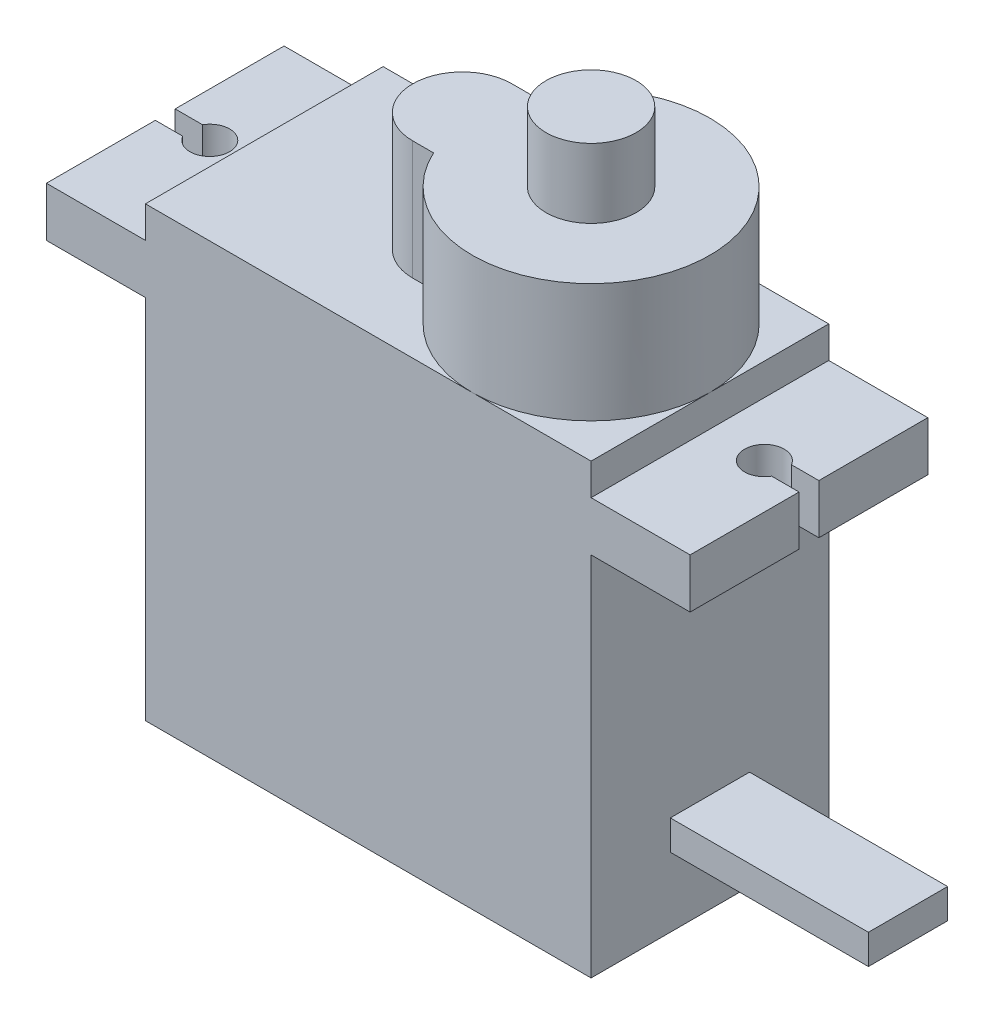
ISO-10303-21;
HEADER;
FILE_DESCRIPTION(('STEP AP214'),'2;1');
FILE_NAME('part.step','',(''),(''),'','','');
FILE_SCHEMA(('AUTOMOTIVE_DESIGN { 1 0 10303 214 1 1 1 1 }'));
ENDSEC;
DATA;
#1=APPLICATION_CONTEXT('core data for automotive mechanical design processes');
#2=APPLICATION_PROTOCOL_DEFINITION('international standard','automotive_design',2000,#1);
#3=PRODUCT_CONTEXT('',#1,'mechanical');
#4=PRODUCT('Part','Part','',(#3));
#5=PRODUCT_RELATED_PRODUCT_CATEGORY('part','',(#4));
#6=PRODUCT_DEFINITION_FORMATION('','',#4);
#7=PRODUCT_DEFINITION_CONTEXT('part definition',#1,'design');
#8=PRODUCT_DEFINITION('design','',#6,#7);
#9=PRODUCT_DEFINITION_SHAPE('','',#8);
#10=(LENGTH_UNIT() NAMED_UNIT(*) SI_UNIT(.MILLI.,.METRE.));
#11=(NAMED_UNIT(*) PLANE_ANGLE_UNIT() SI_UNIT($,.RADIAN.));
#12=(NAMED_UNIT(*) SI_UNIT($,.STERADIAN.) SOLID_ANGLE_UNIT());
#13=UNCERTAINTY_MEASURE_WITH_UNIT(LENGTH_MEASURE(1.E-05),#10,'distance_accuracy_value','');
#14=(GEOMETRIC_REPRESENTATION_CONTEXT(3) GLOBAL_UNCERTAINTY_ASSIGNED_CONTEXT((#13)) GLOBAL_UNIT_ASSIGNED_CONTEXT((#10,
#11,#12)) REPRESENTATION_CONTEXT('',''));
#15=CARTESIAN_POINT('',(0.,0.,0.));
#16=DIRECTION('',(0.,0.,1.));
#17=DIRECTION('',(1.,0.,0.));
#18=AXIS2_PLACEMENT_3D('',#15,#16,#17);
#19=CARTESIAN_POINT('',(-11.25,11.3,-12.));
#20=DIRECTION('',(0.,1.,0.));
#21=DIRECTION('',(0.,0.,1.));
#22=AXIS2_PLACEMENT_3D('',#19,#20,#21);
#23=PLANE('',#22);
#24=CARTESIAN_POINT('',(5.25,11.3,-6.));
#25=DIRECTION('',(0.,1.,0.));
#26=DIRECTION('',(0.,0.,1.));
#27=AXIS2_PLACEMENT_3D('',#24,#25,#26);
#28=CIRCLE('',#27,6.);
#29=CARTESIAN_POINT('',(5.25,11.3,0.));
#30=VERTEX_POINT('',#29);
#31=CARTESIAN_POINT('',(11.25,11.3,-6.));
#32=VERTEX_POINT('',#31);
#33=EDGE_CURVE('E11',#30,#32,#28,.T.);
#34=ORIENTED_EDGE('',*,*,#33,.F.);
#35=DIRECTION('',(-1.,0.,0.));
#36=VECTOR('',#35,1.);
#37=CARTESIAN_POINT('',(-11.25,11.3,0.));
#38=LINE('',#37,#36);
#39=CARTESIAN_POINT('',(11.25,11.3,0.));
#40=VERTEX_POINT('',#39);
#41=EDGE_CURVE('E396',#40,#30,#38,.T.);
#42=ORIENTED_EDGE('',*,*,#41,.F.);
#43=DIRECTION('',(0.,0.,1.));
#44=VECTOR('',#43,1.);
#45=CARTESIAN_POINT('',(11.25,11.3,-12.));
#46=LINE('',#45,#44);
#47=EDGE_CURVE('E439',#32,#40,#46,.T.);
#48=ORIENTED_EDGE('',*,*,#47,.F.);
#49=EDGE_LOOP('',(#34,#42,#48));
#50=FACE_BOUND('',#49,.T.);
#51=ADVANCED_FACE('F37',(#50),#23,.T.);
#52=CARTESIAN_POINT('',(5.25,11.3,-12.));
#53=VERTEX_POINT('',#52);
#54=EDGE_CURVE('E46',#32,#53,#28,.T.);
#55=ORIENTED_EDGE('',*,*,#54,.F.);
#56=CARTESIAN_POINT('',(11.25,11.3,-12.));
#57=VERTEX_POINT('',#56);
#58=EDGE_CURVE('E436',#57,#32,#46,.T.);
#59=ORIENTED_EDGE('',*,*,#58,.F.);
#60=DIRECTION('',(-1.,0.,0.));
#61=VECTOR('',#60,1.);
#62=CARTESIAN_POINT('',(-11.25,11.3,-12.));
#63=LINE('',#62,#61);
#64=EDGE_CURVE('E360',#57,#53,#63,.T.);
#65=ORIENTED_EDGE('',*,*,#64,.T.);
#66=EDGE_LOOP('',(#55,#59,#65));
#67=FACE_BOUND('',#66,.T.);
#68=ADVANCED_FACE('F505',(#67),#23,.T.);
#69=CARTESIAN_POINT('',(16.25,9.69999999999999,-12.));
#70=DIRECTION('',(1.,0.,0.));
#71=DIRECTION('',(0.,0.,-1.));
#72=AXIS2_PLACEMENT_3D('',#69,#70,#71);
#73=PLANE('',#72);
#74=DIRECTION('',(0.,1.,0.));
#75=VECTOR('',#74,1.);
#76=CARTESIAN_POINT('',(16.25,7.19999999999999,-5.5));
#77=LINE('',#76,#75);
#78=CARTESIAN_POINT('',(16.25,7.19999999999999,-5.5));
#79=VERTEX_POINT('',#78);
#80=CARTESIAN_POINT('',(16.25,9.69999999999999,-5.5));
#81=VERTEX_POINT('',#80);
#82=EDGE_CURVE('E279',#79,#81,#77,.T.);
#83=ORIENTED_EDGE('',*,*,#82,.T.);
#84=DIRECTION('',(0.,0.,1.));
#85=VECTOR('',#84,1.);
#86=CARTESIAN_POINT('',(16.25,9.69999999999999,-12.));
#87=LINE('',#86,#85);
#88=CARTESIAN_POINT('',(16.25,9.69999999999999,0.));
#89=VERTEX_POINT('',#88);
#90=EDGE_CURVE('E444',#81,#89,#87,.T.);
#91=ORIENTED_EDGE('',*,*,#90,.T.);
#92=DIRECTION('',(0.,1.,0.));
#93=VECTOR('',#92,1.);
#94=CARTESIAN_POINT('',(16.25,9.69999999999999,0.));
#95=LINE('',#94,#93);
#96=CARTESIAN_POINT('',(16.25,7.19999999999999,0.));
#97=VERTEX_POINT('',#96);
#98=EDGE_CURVE('E386',#97,#89,#95,.T.);
#99=ORIENTED_EDGE('',*,*,#98,.F.);
#100=DIRECTION('',(0.,0.,1.));
#101=VECTOR('',#100,1.);
#102=CARTESIAN_POINT('',(16.25,7.19999999999999,-12.));
#103=LINE('',#102,#101);
#104=EDGE_CURVE('E447',#79,#97,#103,.T.);
#105=ORIENTED_EDGE('',*,*,#104,.F.);
#106=EDGE_LOOP('',(#83,#91,#99,#105));
#107=FACE_BOUND('',#106,.T.);
#108=ADVANCED_FACE('F488',(#107),#73,.T.);
#109=CARTESIAN_POINT('',(-16.25,9.69999999999999,-12.));
#110=DIRECTION('',(-1.,0.,0.));
#111=DIRECTION('',(0.,0.,1.));
#112=AXIS2_PLACEMENT_3D('',#109,#110,#111);
#113=PLANE('',#112);
#114=DIRECTION('',(0.,1.,0.));
#115=VECTOR('',#114,1.);
#116=CARTESIAN_POINT('',(-16.25,7.19999999999999,-6.5));
#117=LINE('',#116,#115);
#118=CARTESIAN_POINT('',(-16.25,7.19999999999999,-6.5));
#119=VERTEX_POINT('',#118);
#120=CARTESIAN_POINT('',(-16.25,9.69999999999999,-6.5));
#121=VERTEX_POINT('',#120);
#122=EDGE_CURVE('E305',#119,#121,#117,.T.);
#123=ORIENTED_EDGE('',*,*,#122,.T.);
#124=DIRECTION('',(0.,0.,1.));
#125=VECTOR('',#124,1.);
#126=CARTESIAN_POINT('',(-16.25,9.69999999999999,-12.));
#127=LINE('',#126,#125);
#128=CARTESIAN_POINT('',(-16.25,9.69999999999999,-12.));
#129=VERTEX_POINT('',#128);
#130=EDGE_CURVE('E427',#129,#121,#127,.T.);
#131=ORIENTED_EDGE('',*,*,#130,.F.);
#132=DIRECTION('',(0.,-1.,0.));
#133=VECTOR('',#132,1.);
#134=CARTESIAN_POINT('',(-16.25,9.69999999999999,-12.));
#135=LINE('',#134,#133);
#136=CARTESIAN_POINT('',(-16.25,7.19999999999999,-12.));
#137=VERTEX_POINT('',#136);
#138=EDGE_CURVE('E369',#129,#137,#135,.T.);
#139=ORIENTED_EDGE('',*,*,#138,.T.);
#140=DIRECTION('',(0.,0.,1.));
#141=VECTOR('',#140,1.);
#142=CARTESIAN_POINT('',(-16.25,7.19999999999999,-12.));
#143=LINE('',#142,#141);
#144=EDGE_CURVE('E423',#137,#119,#143,.T.);
#145=ORIENTED_EDGE('',*,*,#144,.T.);
#146=EDGE_LOOP('',(#123,#131,#139,#145));
#147=FACE_BOUND('',#146,.T.);
#148=ADVANCED_FACE('F535',(#147),#113,.T.);
#149=CARTESIAN_POINT('',(11.25,7.19999999999999,-12.));
#150=DIRECTION('',(1.,0.,0.));
#151=DIRECTION('',(0.,1.,0.));
#152=AXIS2_PLACEMENT_3D('',#149,#150,#151);
#153=PLANE('',#152);
#154=DIRECTION('',(0.,1.,0.));
#155=VECTOR('',#154,1.);
#156=CARTESIAN_POINT('',(11.25,7.19999999999999,0.));
#157=LINE('',#156,#155);
#158=CARTESIAN_POINT('',(11.25,-11.3,0.));
#159=VERTEX_POINT('',#158);
#160=CARTESIAN_POINT('',(11.25,7.19999999999999,0.));
#161=VERTEX_POINT('',#160);
#162=EDGE_CURVE('E342',#159,#161,#157,.T.);
#163=ORIENTED_EDGE('',*,*,#162,.F.);
#164=DIRECTION('',(0.,0.,1.));
#165=VECTOR('',#164,1.);
#166=CARTESIAN_POINT('',(11.25,-11.3,-12.));
#167=LINE('',#166,#165);
#168=CARTESIAN_POINT('',(11.25,-11.3,-12.));
#169=VERTEX_POINT('',#168);
#170=EDGE_CURVE('E416',#169,#159,#167,.T.);
#171=ORIENTED_EDGE('',*,*,#170,.F.);
#172=DIRECTION('',(0.,1.,0.));
#173=VECTOR('',#172,1.);
#174=CARTESIAN_POINT('',(11.25,7.19999999999999,-12.));
#175=LINE('',#174,#173);
#176=CARTESIAN_POINT('',(11.25,7.19999999999999,-12.));
#177=VERTEX_POINT('',#176);
#178=EDGE_CURVE('E343',#169,#177,#175,.T.);
#179=ORIENTED_EDGE('',*,*,#178,.T.);
#180=DIRECTION('',(0.,0.,1.));
#181=VECTOR('',#180,1.);
#182=CARTESIAN_POINT('',(11.25,7.19999999999999,-12.));
#183=LINE('',#182,#181);
#184=EDGE_CURVE('E41',#177,#161,#183,.T.);
#185=ORIENTED_EDGE('',*,*,#184,.T.);
#186=EDGE_LOOP('',(#163,#171,#179,#185));
#187=FACE_BOUND('',#186,.T.);
#188=DIRECTION('',(0.,0.,-1.));
#189=VECTOR('',#188,1.);
#190=CARTESIAN_POINT('',(11.25,-7.80000000000001,-4.));
#191=LINE('',#190,#189);
#192=CARTESIAN_POINT('',(11.25,-7.80000000000001,-4.));
#193=VERTEX_POINT('',#192);
#194=CARTESIAN_POINT('',(11.25,-7.80000000000001,-8.));
#195=VERTEX_POINT('',#194);
#196=EDGE_CURVE('E327',#193,#195,#191,.T.);
#197=ORIENTED_EDGE('',*,*,#196,.F.);
#198=DIRECTION('',(0.,-1.,0.));
#199=VECTOR('',#198,1.);
#200=CARTESIAN_POINT('',(11.25,-6.30000000000001,-4.));
#201=LINE('',#200,#199);
#202=CARTESIAN_POINT('',(11.25,-6.30000000000001,-4.));
#203=VERTEX_POINT('',#202);
#204=EDGE_CURVE('E308',#203,#193,#201,.T.);
#205=ORIENTED_EDGE('',*,*,#204,.F.);
#206=DIRECTION('',(0.,0.,1.));
#207=VECTOR('',#206,1.);
#208=CARTESIAN_POINT('',(11.25,-6.30000000000001,-4.));
#209=LINE('',#208,#207);
#210=CARTESIAN_POINT('',(11.25,-6.30000000000001,-8.));
#211=VERTEX_POINT('',#210);
#212=EDGE_CURVE('E318',#211,#203,#209,.T.);
#213=ORIENTED_EDGE('',*,*,#212,.F.);
#214=DIRECTION('',(0.,1.,0.));
#215=VECTOR('',#214,1.);
#216=CARTESIAN_POINT('',(11.25,-6.30000000000001,-8.));
#217=LINE('',#216,#215);
#218=EDGE_CURVE('E329',#195,#211,#217,.T.);
#219=ORIENTED_EDGE('',*,*,#218,.F.);
#220=EDGE_LOOP('',(#197,#205,#213,#219));
#221=FACE_BOUND('',#220,.T.);
#222=ADVANCED_FACE('F39',(#187,#221),#153,.T.);
#223=CARTESIAN_POINT('',(-11.25,-11.3,-12.));
#224=DIRECTION('',(0.,-1.,0.));
#225=DIRECTION('',(0.,0.,-1.));
#226=AXIS2_PLACEMENT_3D('',#223,#224,#225);
#227=PLANE('',#226);
#228=DIRECTION('',(1.,0.,0.));
#229=VECTOR('',#228,1.);
#230=CARTESIAN_POINT('',(-11.25,-11.3,0.));
#231=LINE('',#230,#229);
#232=CARTESIAN_POINT('',(-11.25,-11.3,0.));
#233=VERTEX_POINT('',#232);
#234=EDGE_CURVE('E347',#233,#159,#231,.T.);
#235=ORIENTED_EDGE('',*,*,#234,.F.);
#236=DIRECTION('',(0.,0.,1.));
#237=VECTOR('',#236,1.);
#238=CARTESIAN_POINT('',(-11.25,-11.3,-12.));
#239=LINE('',#238,#237);
#240=CARTESIAN_POINT('',(-11.25,-11.3,-12.));
#241=VERTEX_POINT('',#240);
#242=EDGE_CURVE('E419',#241,#233,#239,.T.);
#243=ORIENTED_EDGE('',*,*,#242,.F.);
#244=DIRECTION('',(1.,0.,0.));
#245=VECTOR('',#244,1.);
#246=CARTESIAN_POINT('',(-11.25,-11.3,-12.));
#247=LINE('',#246,#245);
#248=EDGE_CURVE('E378',#241,#169,#247,.T.);
#249=ORIENTED_EDGE('',*,*,#248,.T.);
#250=ORIENTED_EDGE('',*,*,#170,.T.);
#251=EDGE_LOOP('',(#235,#243,#249,#250));
#252=FACE_BOUND('',#251,.T.);
#253=ADVANCED_FACE('F463',(#252),#227,.T.);
#254=CARTESIAN_POINT('',(-11.25,7.19999999999999,-12.));
#255=DIRECTION('',(-1.,0.,0.));
#256=DIRECTION('',(0.,-1.,0.));
#257=AXIS2_PLACEMENT_3D('',#254,#255,#256);
#258=PLANE('',#257);
#259=DIRECTION('',(0.,-1.,0.));
#260=VECTOR('',#259,1.);
#261=CARTESIAN_POINT('',(-11.25,7.19999999999999,0.));
#262=LINE('',#261,#260);
#263=CARTESIAN_POINT('',(-11.25,7.19999999999999,0.));
#264=VERTEX_POINT('',#263);
#265=EDGE_CURVE('E411',#264,#233,#262,.T.);
#266=ORIENTED_EDGE('',*,*,#265,.F.);
#267=DIRECTION('',(0.,0.,1.));
#268=VECTOR('',#267,1.);
#269=CARTESIAN_POINT('',(-11.25,7.19999999999999,-12.));
#270=LINE('',#269,#268);
#271=CARTESIAN_POINT('',(-11.25,7.19999999999999,-12.));
#272=VERTEX_POINT('',#271);
#273=EDGE_CURVE('E421',#272,#264,#270,.T.);
#274=ORIENTED_EDGE('',*,*,#273,.F.);
#275=DIRECTION('',(0.,-1.,0.));
#276=VECTOR('',#275,1.);
#277=CARTESIAN_POINT('',(-11.25,7.19999999999999,-12.));
#278=LINE('',#277,#276);
#279=EDGE_CURVE('E375',#272,#241,#278,.T.);
#280=ORIENTED_EDGE('',*,*,#279,.T.);
#281=ORIENTED_EDGE('',*,*,#242,.T.);
#282=EDGE_LOOP('',(#266,#274,#280,#281));
#283=FACE_BOUND('',#282,.T.);
#284=ADVANCED_FACE('F532',(#283),#258,.T.);
#285=CARTESIAN_POINT('',(-16.25,7.19999999999999,-12.));
#286=DIRECTION('',(0.,-1.,0.));
#287=DIRECTION('',(0.,0.,-1.));
#288=AXIS2_PLACEMENT_3D('',#285,#286,#287);
#289=PLANE('',#288);
#290=DIRECTION('',(-1.,0.,0.));
#291=VECTOR('',#290,1.);
#292=CARTESIAN_POINT('',(-16.25,7.19999999999999,-6.5));
#293=LINE('',#292,#291);
#294=CARTESIAN_POINT('',(-14.8660254037844,7.19999999999999,-6.5));
#295=VERTEX_POINT('',#294);
#296=EDGE_CURVE('E295',#295,#119,#293,.T.);
#297=ORIENTED_EDGE('',*,*,#296,.T.);
#298=ORIENTED_EDGE('',*,*,#144,.F.);
#299=DIRECTION('',(1.,0.,0.));
#300=VECTOR('',#299,1.);
#301=CARTESIAN_POINT('',(-16.25,7.19999999999999,-12.));
#302=LINE('',#301,#300);
#303=EDGE_CURVE('E372',#137,#272,#302,.T.);
#304=ORIENTED_EDGE('',*,*,#303,.T.);
#305=ORIENTED_EDGE('',*,*,#273,.T.);
#306=DIRECTION('',(1.,0.,0.));
#307=VECTOR('',#306,1.);
#308=CARTESIAN_POINT('',(-16.25,7.19999999999999,0.));
#309=LINE('',#308,#307);
#310=CARTESIAN_POINT('',(-16.25,7.19999999999999,0.));
#311=VERTEX_POINT('',#310);
#312=EDGE_CURVE('E408',#311,#264,#309,.T.);
#313=ORIENTED_EDGE('',*,*,#312,.F.);
#314=CARTESIAN_POINT('',(-16.25,7.19999999999999,-5.5));
#315=VERTEX_POINT('',#314);
#316=EDGE_CURVE('E426',#315,#311,#143,.T.);
#317=ORIENTED_EDGE('',*,*,#316,.F.);
#318=DIRECTION('',(1.,0.,0.));
#319=VECTOR('',#318,1.);
#320=CARTESIAN_POINT('',(-16.25,7.19999999999999,-5.5));
#321=LINE('',#320,#319);
#322=CARTESIAN_POINT('',(-14.8660254037844,7.19999999999999,-5.5));
#323=VERTEX_POINT('',#322);
#324=EDGE_CURVE('E288',#315,#323,#321,.T.);
#325=ORIENTED_EDGE('',*,*,#324,.T.);
#326=CARTESIAN_POINT('',(-14.,7.19999999999999,-6.));
#327=DIRECTION('',(0.,1.,0.));
#328=DIRECTION('',(0.,0.,1.));
#329=AXIS2_PLACEMENT_3D('',#326,#327,#328);
#330=CIRCLE('',#329,1.);
#331=EDGE_CURVE('E291',#323,#295,#330,.T.);
#332=ORIENTED_EDGE('',*,*,#331,.T.);
#333=EDGE_LOOP('',(#297,#298,#304,#305,#313,#317,#325,#332));
#334=FACE_BOUND('',#333,.T.);
#335=ADVANCED_FACE('F529',(#334),#289,.T.);
#336=DIRECTION('',(0.,1.,0.));
#337=VECTOR('',#336,1.);
#338=CARTESIAN_POINT('',(-16.25,7.19999999999999,-5.5));
#339=LINE('',#338,#337);
#340=CARTESIAN_POINT('',(-16.25,9.69999999999999,-5.5));
#341=VERTEX_POINT('',#340);
#342=EDGE_CURVE('E298',#315,#341,#339,.T.);
#343=ORIENTED_EDGE('',*,*,#342,.F.);
#344=ORIENTED_EDGE('',*,*,#316,.T.);
#345=DIRECTION('',(0.,-1.,0.));
#346=VECTOR('',#345,1.);
#347=CARTESIAN_POINT('',(-16.25,9.69999999999999,0.));
#348=LINE('',#347,#346);
#349=CARTESIAN_POINT('',(-16.25,9.69999999999999,0.));
#350=VERTEX_POINT('',#349);
#351=EDGE_CURVE('E405',#350,#311,#348,.T.);
#352=ORIENTED_EDGE('',*,*,#351,.F.);
#353=EDGE_CURVE('E430',#341,#350,#127,.T.);
#354=ORIENTED_EDGE('',*,*,#353,.F.);
#355=EDGE_LOOP('',(#343,#344,#352,#354));
#356=FACE_BOUND('',#355,.T.);
#357=ADVANCED_FACE('F525',(#356),#113,.T.);
#358=CARTESIAN_POINT('',(-11.25,9.69999999999999,-12.));
#359=DIRECTION('',(0.,1.,0.));
#360=DIRECTION('',(0.,0.,1.));
#361=AXIS2_PLACEMENT_3D('',#358,#359,#360);
#362=PLANE('',#361);
#363=DIRECTION('',(-1.,0.,0.));
#364=VECTOR('',#363,1.);
#365=CARTESIAN_POINT('',(-16.25,9.69999999999999,-6.5));
#366=LINE('',#365,#364);
#367=CARTESIAN_POINT('',(-14.8660254037844,9.69999999999999,-6.5));
#368=VERTEX_POINT('',#367);
#369=EDGE_CURVE('E292',#368,#121,#366,.T.);
#370=ORIENTED_EDGE('',*,*,#369,.F.);
#371=CARTESIAN_POINT('',(-14.,9.69999999999999,-6.));
#372=DIRECTION('',(0.,1.,0.));
#373=DIRECTION('',(0.,0.,1.));
#374=AXIS2_PLACEMENT_3D('',#371,#372,#373);
#375=CIRCLE('',#374,1.);
#376=CARTESIAN_POINT('',(-14.8660254037844,9.69999999999999,-5.5));
#377=VERTEX_POINT('',#376);
#378=EDGE_CURVE('E301',#377,#368,#375,.T.);
#379=ORIENTED_EDGE('',*,*,#378,.F.);
#380=DIRECTION('',(1.,0.,0.));
#381=VECTOR('',#380,1.);
#382=CARTESIAN_POINT('',(-16.25,9.69999999999999,-5.5));
#383=LINE('',#382,#381);
#384=EDGE_CURVE('E282',#341,#377,#383,.T.);
#385=ORIENTED_EDGE('',*,*,#384,.F.);
#386=ORIENTED_EDGE('',*,*,#353,.T.);
#387=DIRECTION('',(-1.,0.,0.));
#388=VECTOR('',#387,1.);
#389=CARTESIAN_POINT('',(-11.25,9.69999999999999,0.));
#390=LINE('',#389,#388);
#391=CARTESIAN_POINT('',(-11.25,9.69999999999999,0.));
#392=VERTEX_POINT('',#391);
#393=EDGE_CURVE('E402',#392,#350,#390,.T.);
#394=ORIENTED_EDGE('',*,*,#393,.F.);
#395=DIRECTION('',(0.,0.,1.));
#396=VECTOR('',#395,1.);
#397=CARTESIAN_POINT('',(-11.25,9.69999999999999,-12.));
#398=LINE('',#397,#396);
#399=CARTESIAN_POINT('',(-11.25,9.69999999999999,-12.));
#400=VERTEX_POINT('',#399);
#401=EDGE_CURVE('E431',#400,#392,#398,.T.);
#402=ORIENTED_EDGE('',*,*,#401,.F.);
#403=DIRECTION('',(-1.,0.,0.));
#404=VECTOR('',#403,1.);
#405=CARTESIAN_POINT('',(-11.25,9.69999999999999,-12.));
#406=LINE('',#405,#404);
#407=EDGE_CURVE('E366',#400,#129,#406,.T.);
#408=ORIENTED_EDGE('',*,*,#407,.T.);
#409=ORIENTED_EDGE('',*,*,#130,.T.);
#410=EDGE_LOOP('',(#370,#379,#385,#386,#394,#402,#408,#409));
#411=FACE_BOUND('',#410,.T.);
#412=ADVANCED_FACE('F519',(#411),#362,.T.);
#413=CARTESIAN_POINT('',(-11.25,11.3,-12.));
#414=DIRECTION('',(-1.,0.,0.));
#415=DIRECTION('',(0.,0.,1.));
#416=AXIS2_PLACEMENT_3D('',#413,#414,#415);
#417=PLANE('',#416);
#418=DIRECTION('',(0.,-1.,0.));
#419=VECTOR('',#418,1.);
#420=CARTESIAN_POINT('',(-11.25,11.3,0.));
#421=LINE('',#420,#419);
#422=CARTESIAN_POINT('',(-11.25,11.3,0.));
#423=VERTEX_POINT('',#422);
#424=EDGE_CURVE('E399',#423,#392,#421,.T.);
#425=ORIENTED_EDGE('',*,*,#424,.F.);
#426=DIRECTION('',(0.,0.,1.));
#427=VECTOR('',#426,1.);
#428=CARTESIAN_POINT('',(-11.25,11.3,-12.));
#429=LINE('',#428,#427);
#430=CARTESIAN_POINT('',(-11.25,11.3,-12.));
#431=VERTEX_POINT('',#430);
#432=EDGE_CURVE('E433',#431,#423,#429,.T.);
#433=ORIENTED_EDGE('',*,*,#432,.F.);
#434=DIRECTION('',(0.,-1.,0.));
#435=VECTOR('',#434,1.);
#436=CARTESIAN_POINT('',(-11.25,11.3,-12.));
#437=LINE('',#436,#435);
#438=EDGE_CURVE('E363',#431,#400,#437,.T.);
#439=ORIENTED_EDGE('',*,*,#438,.T.);
#440=ORIENTED_EDGE('',*,*,#401,.T.);
#441=EDGE_LOOP('',(#425,#433,#439,#440));
#442=FACE_BOUND('',#441,.T.);
#443=ADVANCED_FACE('F514',(#442),#417,.T.);
#444=CARTESIAN_POINT('',(-0.204356057317856,11.3,-8.5));
#445=VERTEX_POINT('',#444);
#446=EDGE_CURVE('E418',#53,#445,#28,.T.);
#447=ORIENTED_EDGE('',*,*,#446,.F.);
#448=EDGE_CURVE('E359',#53,#431,#63,.T.);
#449=ORIENTED_EDGE('',*,*,#448,.T.);
#450=ORIENTED_EDGE('',*,*,#432,.T.);
#451=EDGE_CURVE('E395',#30,#423,#38,.T.);
#452=ORIENTED_EDGE('',*,*,#451,.F.);
#453=CARTESIAN_POINT('',(-0.204356057317856,11.3,-3.5));
#454=VERTEX_POINT('',#453);
#455=EDGE_CURVE('E48',#454,#30,#28,.T.);
#456=ORIENTED_EDGE('',*,*,#455,.F.);
#457=DIRECTION('',(-1.,0.,0.));
#458=VECTOR('',#457,1.);
#459=CARTESIAN_POINT('',(0.,11.3,-3.5));
#460=LINE('',#459,#458);
#461=CARTESIAN_POINT('',(-1.25435605731786,11.3,-3.5));
#462=VERTEX_POINT('',#461);
#463=EDGE_CURVE('E500',#454,#462,#460,.T.);
#464=ORIENTED_EDGE('',*,*,#463,.T.);
#465=CARTESIAN_POINT('',(-1.25,11.3,-6.));
#466=DIRECTION('',(0.,1.,0.));
#467=DIRECTION('',(0.,0.,1.));
#468=AXIS2_PLACEMENT_3D('',#465,#466,#467);
#469=CIRCLE('',#468,2.5);
#470=CARTESIAN_POINT('',(-1.25435605731786,11.3,-8.5));
#471=VERTEX_POINT('',#470);
#472=EDGE_CURVE('E501',#471,#462,#469,.T.);
#473=ORIENTED_EDGE('',*,*,#472,.F.);
#474=DIRECTION('',(-1.,0.,0.));
#475=VECTOR('',#474,1.);
#476=CARTESIAN_POINT('',(0.,11.3,-8.5));
#477=LINE('',#476,#475);
#478=EDGE_CURVE('E55',#445,#471,#477,.T.);
#479=ORIENTED_EDGE('',*,*,#478,.F.);
#480=EDGE_LOOP('',(#447,#449,#450,#452,#456,#464,#473,#479));
#481=FACE_BOUND('',#480,.T.);
#482=ADVANCED_FACE('F511',(#481),#23,.T.);
#483=CARTESIAN_POINT('',(11.25,11.3,-12.));
#484=DIRECTION('',(1.,0.,0.));
#485=DIRECTION('',(0.,1.,0.));
#486=AXIS2_PLACEMENT_3D('',#483,#484,#485);
#487=PLANE('',#486);
#488=DIRECTION('',(0.,1.,0.));
#489=VECTOR('',#488,1.);
#490=CARTESIAN_POINT('',(11.25,11.3,0.));
#491=LINE('',#490,#489);
#492=CARTESIAN_POINT('',(11.25,9.69999999999999,0.));
#493=VERTEX_POINT('',#492);
#494=EDGE_CURVE('E392',#493,#40,#491,.T.);
#495=ORIENTED_EDGE('',*,*,#494,.F.);
#496=DIRECTION('',(0.,0.,1.));
#497=VECTOR('',#496,1.);
#498=CARTESIAN_POINT('',(11.25,9.69999999999999,-12.));
#499=LINE('',#498,#497);
#500=CARTESIAN_POINT('',(11.25,9.69999999999999,-12.));
#501=VERTEX_POINT('',#500);
#502=EDGE_CURVE('E440',#501,#493,#499,.T.);
#503=ORIENTED_EDGE('',*,*,#502,.F.);
#504=DIRECTION('',(0.,1.,0.));
#505=VECTOR('',#504,1.);
#506=CARTESIAN_POINT('',(11.25,11.3,-12.));
#507=LINE('',#506,#505);
#508=EDGE_CURVE('E356',#501,#57,#507,.T.);
#509=ORIENTED_EDGE('',*,*,#508,.T.);
#510=ORIENTED_EDGE('',*,*,#58,.T.);
#511=ORIENTED_EDGE('',*,*,#47,.T.);
#512=EDGE_LOOP('',(#495,#503,#509,#510,#511));
#513=FACE_BOUND('',#512,.T.);
#514=ADVANCED_FACE('F492',(#513),#487,.T.);
#515=CARTESIAN_POINT('',(11.25,9.69999999999999,-12.));
#516=DIRECTION('',(0.,1.,0.));
#517=DIRECTION('',(0.,0.,1.));
#518=AXIS2_PLACEMENT_3D('',#515,#516,#517);
#519=PLANE('',#518);
#520=DIRECTION('',(1.,0.,0.));
#521=VECTOR('',#520,1.);
#522=CARTESIAN_POINT('',(16.25,9.69999999999999,-5.5));
#523=LINE('',#522,#521);
#524=CARTESIAN_POINT('',(14.8660254037844,9.69999999999999,-5.5));
#525=VERTEX_POINT('',#524);
#526=EDGE_CURVE('E269',#525,#81,#523,.T.);
#527=ORIENTED_EDGE('',*,*,#526,.F.);
#528=CARTESIAN_POINT('',(14.,9.69999999999999,-6.));
#529=DIRECTION('',(0.,1.,0.));
#530=DIRECTION('',(0.,0.,-1.));
#531=AXIS2_PLACEMENT_3D('',#528,#529,#530);
#532=CIRCLE('',#531,1.);
#533=CARTESIAN_POINT('',(14.8660254037844,9.69999999999999,-6.5));
#534=VERTEX_POINT('',#533);
#535=EDGE_CURVE('E259',#534,#525,#532,.T.);
#536=ORIENTED_EDGE('',*,*,#535,.F.);
#537=DIRECTION('',(-1.,0.,0.));
#538=VECTOR('',#537,1.);
#539=CARTESIAN_POINT('',(16.25,9.69999999999999,-6.5));
#540=LINE('',#539,#538);
#541=CARTESIAN_POINT('',(16.25,9.69999999999999,-6.5));
#542=VERTEX_POINT('',#541);
#543=EDGE_CURVE('E256',#542,#534,#540,.T.);
#544=ORIENTED_EDGE('',*,*,#543,.F.);
#545=CARTESIAN_POINT('',(16.25,9.69999999999999,-12.));
#546=VERTEX_POINT('',#545);
#547=EDGE_CURVE('E442',#546,#542,#87,.T.);
#548=ORIENTED_EDGE('',*,*,#547,.F.);
#549=DIRECTION('',(-1.,0.,0.));
#550=VECTOR('',#549,1.);
#551=CARTESIAN_POINT('',(11.25,9.69999999999999,-12.));
#552=LINE('',#551,#550);
#553=EDGE_CURVE('E353',#546,#501,#552,.T.);
#554=ORIENTED_EDGE('',*,*,#553,.T.);
#555=ORIENTED_EDGE('',*,*,#502,.T.);
#556=DIRECTION('',(-1.,0.,0.));
#557=VECTOR('',#556,1.);
#558=CARTESIAN_POINT('',(11.25,9.69999999999999,0.));
#559=LINE('',#558,#557);
#560=EDGE_CURVE('E389',#89,#493,#559,.T.);
#561=ORIENTED_EDGE('',*,*,#560,.F.);
#562=ORIENTED_EDGE('',*,*,#90,.F.);
#563=EDGE_LOOP('',(#527,#536,#544,#548,#554,#555,#561,#562));
#564=FACE_BOUND('',#563,.T.);
#565=ADVANCED_FACE('F481',(#564),#519,.T.);
#566=DIRECTION('',(0.,1.,0.));
#567=VECTOR('',#566,1.);
#568=CARTESIAN_POINT('',(16.25,7.19999999999999,-6.5));
#569=LINE('',#568,#567);
#570=CARTESIAN_POINT('',(16.25,7.19999999999999,-6.5));
#571=VERTEX_POINT('',#570);
#572=EDGE_CURVE('E274',#571,#542,#569,.T.);
#573=ORIENTED_EDGE('',*,*,#572,.F.);
#574=CARTESIAN_POINT('',(16.25,7.19999999999999,-12.));
#575=VERTEX_POINT('',#574);
#576=EDGE_CURVE('E445',#575,#571,#103,.T.);
#577=ORIENTED_EDGE('',*,*,#576,.F.);
#578=DIRECTION('',(0.,1.,0.));
#579=VECTOR('',#578,1.);
#580=CARTESIAN_POINT('',(16.25,9.69999999999999,-12.));
#581=LINE('',#580,#579);
#582=EDGE_CURVE('E350',#575,#546,#581,.T.);
#583=ORIENTED_EDGE('',*,*,#582,.T.);
#584=ORIENTED_EDGE('',*,*,#547,.T.);
#585=EDGE_LOOP('',(#573,#577,#583,#584));
#586=FACE_BOUND('',#585,.T.);
#587=ADVANCED_FACE('F473',(#586),#73,.T.);
#588=CARTESIAN_POINT('',(16.25,7.19999999999999,-12.));
#589=DIRECTION('',(0.,-1.,0.));
#590=DIRECTION('',(0.,0.,-1.));
#591=AXIS2_PLACEMENT_3D('',#588,#589,#590);
#592=PLANE('',#591);
#593=DIRECTION('',(1.,0.,0.));
#594=VECTOR('',#593,1.);
#595=CARTESIAN_POINT('',(16.25,7.19999999999999,-5.5));
#596=LINE('',#595,#594);
#597=CARTESIAN_POINT('',(14.8660254037844,7.19999999999999,-5.5));
#598=VERTEX_POINT('',#597);
#599=EDGE_CURVE('E272',#598,#79,#596,.T.);
#600=ORIENTED_EDGE('',*,*,#599,.T.);
#601=ORIENTED_EDGE('',*,*,#104,.T.);
#602=DIRECTION('',(1.,0.,0.));
#603=VECTOR('',#602,1.);
#604=CARTESIAN_POINT('',(16.25,7.19999999999999,0.));
#605=LINE('',#604,#603);
#606=EDGE_CURVE('E383',#161,#97,#605,.T.);
#607=ORIENTED_EDGE('',*,*,#606,.F.);
#608=ORIENTED_EDGE('',*,*,#184,.F.);
#609=DIRECTION('',(1.,0.,0.));
#610=VECTOR('',#609,1.);
#611=CARTESIAN_POINT('',(16.25,7.19999999999999,-12.));
#612=LINE('',#611,#610);
#613=EDGE_CURVE('E346',#177,#575,#612,.T.);
#614=ORIENTED_EDGE('',*,*,#613,.T.);
#615=ORIENTED_EDGE('',*,*,#576,.T.);
#616=DIRECTION('',(-1.,0.,0.));
#617=VECTOR('',#616,1.);
#618=CARTESIAN_POINT('',(16.25,7.19999999999999,-6.5));
#619=LINE('',#618,#617);
#620=CARTESIAN_POINT('',(14.8660254037844,7.19999999999999,-6.5));
#621=VERTEX_POINT('',#620);
#622=EDGE_CURVE('E265',#571,#621,#619,.T.);
#623=ORIENTED_EDGE('',*,*,#622,.T.);
#624=CARTESIAN_POINT('',(14.,7.19999999999999,-6.));
#625=DIRECTION('',(0.,1.,0.));
#626=DIRECTION('',(0.,0.,-1.));
#627=AXIS2_PLACEMENT_3D('',#624,#625,#626);
#628=CIRCLE('',#627,1.);
#629=EDGE_CURVE('E268',#621,#598,#628,.T.);
#630=ORIENTED_EDGE('',*,*,#629,.T.);
#631=EDGE_LOOP('',(#600,#601,#607,#608,#614,#615,#623,#630));
#632=FACE_BOUND('',#631,.T.);
#633=ADVANCED_FACE('F457',(#632),#592,.T.);
#634=CARTESIAN_POINT('',(0.,0.,-12.));
#635=DIRECTION('',(0.,0.,1.));
#636=DIRECTION('',(1.,0.,0.));
#637=AXIS2_PLACEMENT_3D('',#634,#635,#636);
#638=PLANE('',#637);
#639=ORIENTED_EDGE('',*,*,#178,.F.);
#640=ORIENTED_EDGE('',*,*,#248,.F.);
#641=ORIENTED_EDGE('',*,*,#279,.F.);
#642=ORIENTED_EDGE('',*,*,#303,.F.);
#643=ORIENTED_EDGE('',*,*,#138,.F.);
#644=ORIENTED_EDGE('',*,*,#407,.F.);
#645=ORIENTED_EDGE('',*,*,#438,.F.);
#646=ORIENTED_EDGE('',*,*,#448,.F.);
#647=ORIENTED_EDGE('',*,*,#64,.F.);
#648=ORIENTED_EDGE('',*,*,#508,.F.);
#649=ORIENTED_EDGE('',*,*,#553,.F.);
#650=ORIENTED_EDGE('',*,*,#582,.F.);
#651=ORIENTED_EDGE('',*,*,#613,.F.);
#652=EDGE_LOOP('',(#639,#640,#641,#642,#643,#644,#645,#646,#647,#648,#649,#650,#651));
#653=FACE_BOUND('',#652,.T.);
#654=ADVANCED_FACE('F466',(#653),#638,.F.);
#655=CARTESIAN_POINT('',(0.,0.,0.));
#656=DIRECTION('',(0.,0.,1.));
#657=DIRECTION('',(1.,0.,0.));
#658=AXIS2_PLACEMENT_3D('',#655,#656,#657);
#659=PLANE('',#658);
#660=ORIENTED_EDGE('',*,*,#162,.T.);
#661=ORIENTED_EDGE('',*,*,#606,.T.);
#662=ORIENTED_EDGE('',*,*,#98,.T.);
#663=ORIENTED_EDGE('',*,*,#560,.T.);
#664=ORIENTED_EDGE('',*,*,#494,.T.);
#665=ORIENTED_EDGE('',*,*,#41,.T.);
#666=ORIENTED_EDGE('',*,*,#451,.T.);
#667=ORIENTED_EDGE('',*,*,#424,.T.);
#668=ORIENTED_EDGE('',*,*,#393,.T.);
#669=ORIENTED_EDGE('',*,*,#351,.T.);
#670=ORIENTED_EDGE('',*,*,#312,.T.);
#671=ORIENTED_EDGE('',*,*,#265,.T.);
#672=ORIENTED_EDGE('',*,*,#234,.T.);
#673=EDGE_LOOP('',(#660,#661,#662,#663,#664,#665,#666,#667,#668,#669,#670,#671,#672));
#674=FACE_BOUND('',#673,.T.);
#675=ADVANCED_FACE('F459',(#674),#659,.T.);
#676=CARTESIAN_POINT('',(21.25,-6.30000000000001,-4.));
#677=DIRECTION('',(0.,0.,-1.));
#678=DIRECTION('',(0.,1.,0.));
#679=AXIS2_PLACEMENT_3D('',#676,#677,#678);
#680=PLANE('',#679);
#681=ORIENTED_EDGE('',*,*,#204,.T.);
#682=DIRECTION('',(-1.,0.,0.));
#683=VECTOR('',#682,1.);
#684=CARTESIAN_POINT('',(21.25,-7.80000000000001,-4.));
#685=LINE('',#684,#683);
#686=CARTESIAN_POINT('',(21.25,-7.80000000000001,-4.));
#687=VERTEX_POINT('',#686);
#688=EDGE_CURVE('E340',#687,#193,#685,.T.);
#689=ORIENTED_EDGE('',*,*,#688,.F.);
#690=DIRECTION('',(0.,-1.,0.));
#691=VECTOR('',#690,1.);
#692=CARTESIAN_POINT('',(21.25,-6.30000000000001,-4.));
#693=LINE('',#692,#691);
#694=CARTESIAN_POINT('',(21.25,-6.30000000000001,-4.));
#695=VERTEX_POINT('',#694);
#696=EDGE_CURVE('E314',#695,#687,#693,.T.);
#697=ORIENTED_EDGE('',*,*,#696,.F.);
#698=DIRECTION('',(-1.,0.,0.));
#699=VECTOR('',#698,1.);
#700=CARTESIAN_POINT('',(21.25,-6.30000000000001,-4.));
#701=LINE('',#700,#699);
#702=EDGE_CURVE('E324',#695,#203,#701,.T.);
#703=ORIENTED_EDGE('',*,*,#702,.T.);
#704=EDGE_LOOP('',(#681,#689,#697,#703));
#705=FACE_BOUND('',#704,.T.);
#706=ADVANCED_FACE('F581',(#705),#680,.F.);
#707=CARTESIAN_POINT('',(21.25,-7.80000000000001,-4.));
#708=DIRECTION('',(0.,1.,0.));
#709=DIRECTION('',(-1.,0.,0.));
#710=AXIS2_PLACEMENT_3D('',#707,#708,#709);
#711=PLANE('',#710);
#712=ORIENTED_EDGE('',*,*,#196,.T.);
#713=DIRECTION('',(-1.,0.,0.));
#714=VECTOR('',#713,1.);
#715=CARTESIAN_POINT('',(21.25,-7.80000000000001,-8.));
#716=LINE('',#715,#714);
#717=CARTESIAN_POINT('',(21.25,-7.80000000000001,-8.));
#718=VERTEX_POINT('',#717);
#719=EDGE_CURVE('E337',#718,#195,#716,.T.);
#720=ORIENTED_EDGE('',*,*,#719,.F.);
#721=DIRECTION('',(0.,0.,-1.));
#722=VECTOR('',#721,1.);
#723=CARTESIAN_POINT('',(21.25,-7.80000000000001,-4.));
#724=LINE('',#723,#722);
#725=EDGE_CURVE('E317',#687,#718,#724,.T.);
#726=ORIENTED_EDGE('',*,*,#725,.F.);
#727=ORIENTED_EDGE('',*,*,#688,.T.);
#728=EDGE_LOOP('',(#712,#720,#726,#727));
#729=FACE_BOUND('',#728,.T.);
#730=ADVANCED_FACE('F586',(#729),#711,.F.);
#731=CARTESIAN_POINT('',(21.25,-6.30000000000001,-8.));
#732=DIRECTION('',(0.,0.,1.));
#733=DIRECTION('',(0.,-1.,0.));
#734=AXIS2_PLACEMENT_3D('',#731,#732,#733);
#735=PLANE('',#734);
#736=ORIENTED_EDGE('',*,*,#218,.T.);
#737=DIRECTION('',(-1.,0.,0.));
#738=VECTOR('',#737,1.);
#739=CARTESIAN_POINT('',(21.25,-6.30000000000001,-8.));
#740=LINE('',#739,#738);
#741=CARTESIAN_POINT('',(21.25,-6.30000000000001,-8.));
#742=VERTEX_POINT('',#741);
#743=EDGE_CURVE('E335',#742,#211,#740,.T.);
#744=ORIENTED_EDGE('',*,*,#743,.F.);
#745=DIRECTION('',(0.,1.,0.));
#746=VECTOR('',#745,1.);
#747=CARTESIAN_POINT('',(21.25,-6.30000000000001,-8.));
#748=LINE('',#747,#746);
#749=EDGE_CURVE('E320',#718,#742,#748,.T.);
#750=ORIENTED_EDGE('',*,*,#749,.F.);
#751=ORIENTED_EDGE('',*,*,#719,.T.);
#752=EDGE_LOOP('',(#736,#744,#750,#751));
#753=FACE_BOUND('',#752,.T.);
#754=ADVANCED_FACE('F590',(#753),#735,.F.);
#755=CARTESIAN_POINT('',(21.25,-6.30000000000001,-4.));
#756=DIRECTION('',(0.,-1.,0.));
#757=DIRECTION('',(1.,0.,0.));
#758=AXIS2_PLACEMENT_3D('',#755,#756,#757);
#759=PLANE('',#758);
#760=ORIENTED_EDGE('',*,*,#212,.T.);
#761=ORIENTED_EDGE('',*,*,#702,.F.);
#762=DIRECTION('',(0.,0.,1.));
#763=VECTOR('',#762,1.);
#764=CARTESIAN_POINT('',(21.25,-6.30000000000001,-4.));
#765=LINE('',#764,#763);
#766=EDGE_CURVE('E322',#742,#695,#765,.T.);
#767=ORIENTED_EDGE('',*,*,#766,.F.);
#768=ORIENTED_EDGE('',*,*,#743,.T.);
#769=EDGE_LOOP('',(#760,#761,#767,#768));
#770=FACE_BOUND('',#769,.T.);
#771=ADVANCED_FACE('F594',(#770),#759,.F.);
#772=CARTESIAN_POINT('',(21.25,0.,0.));
#773=DIRECTION('',(1.,0.,0.));
#774=DIRECTION('',(0.,0.,-1.));
#775=AXIS2_PLACEMENT_3D('',#772,#773,#774);
#776=PLANE('',#775);
#777=ORIENTED_EDGE('',*,*,#696,.T.);
#778=ORIENTED_EDGE('',*,*,#725,.T.);
#779=ORIENTED_EDGE('',*,*,#749,.T.);
#780=ORIENTED_EDGE('',*,*,#766,.T.);
#781=EDGE_LOOP('',(#777,#778,#779,#780));
#782=FACE_BOUND('',#781,.T.);
#783=ADVANCED_FACE('F597',(#782),#776,.T.);
#784=CARTESIAN_POINT('',(-16.25,7.19999999999999,-6.5));
#785=DIRECTION('',(0.,0.,-1.));
#786=DIRECTION('',(-1.,0.,0.));
#787=AXIS2_PLACEMENT_3D('',#784,#785,#786);
#788=PLANE('',#787);
#789=ORIENTED_EDGE('',*,*,#369,.T.);
#790=ORIENTED_EDGE('',*,*,#122,.F.);
#791=ORIENTED_EDGE('',*,*,#296,.F.);
#792=DIRECTION('',(0.,1.,0.));
#793=VECTOR('',#792,1.);
#794=CARTESIAN_POINT('',(-14.8660254037844,7.19999999999999,-6.5));
#795=LINE('',#794,#793);
#796=EDGE_CURVE('E309',#295,#368,#795,.T.);
#797=ORIENTED_EDGE('',*,*,#796,.T.);
#798=EDGE_LOOP('',(#789,#790,#791,#797));
#799=FACE_BOUND('',#798,.T.);
#800=ADVANCED_FACE('F537',(#799),#788,.F.);
#801=CARTESIAN_POINT('',(-14.,7.19999999999999,-6.));
#802=DIRECTION('',(0.,1.,0.));
#803=DIRECTION('',(0.,0.,1.));
#804=AXIS2_PLACEMENT_3D('',#801,#802,#803);
#805=CYLINDRICAL_SURFACE('',#804,1.);
#806=ORIENTED_EDGE('',*,*,#378,.T.);
#807=ORIENTED_EDGE('',*,*,#796,.F.);
#808=ORIENTED_EDGE('',*,*,#331,.F.);
#809=DIRECTION('',(0.,1.,0.));
#810=VECTOR('',#809,1.);
#811=CARTESIAN_POINT('',(-14.8660254037844,7.19999999999999,-5.5));
#812=LINE('',#811,#810);
#813=EDGE_CURVE('E311',#323,#377,#812,.T.);
#814=ORIENTED_EDGE('',*,*,#813,.T.);
#815=EDGE_LOOP('',(#806,#807,#808,#814));
#816=FACE_BOUND('',#815,.T.);
#817=ADVANCED_FACE('F541',(#816),#805,.F.);
#818=CARTESIAN_POINT('',(-16.25,7.19999999999999,-5.5));
#819=DIRECTION('',(0.,0.,1.));
#820=DIRECTION('',(1.,0.,0.));
#821=AXIS2_PLACEMENT_3D('',#818,#819,#820);
#822=PLANE('',#821);
#823=ORIENTED_EDGE('',*,*,#384,.T.);
#824=ORIENTED_EDGE('',*,*,#813,.F.);
#825=ORIENTED_EDGE('',*,*,#324,.F.);
#826=ORIENTED_EDGE('',*,*,#342,.T.);
#827=EDGE_LOOP('',(#823,#824,#825,#826));
#828=FACE_BOUND('',#827,.T.);
#829=ADVANCED_FACE('F543',(#828),#822,.F.);
#830=CARTESIAN_POINT('',(16.25,7.19999999999999,-5.5));
#831=DIRECTION('',(0.,0.,1.));
#832=DIRECTION('',(1.,0.,0.));
#833=AXIS2_PLACEMENT_3D('',#830,#831,#832);
#834=PLANE('',#833);
#835=ORIENTED_EDGE('',*,*,#526,.T.);
#836=ORIENTED_EDGE('',*,*,#82,.F.);
#837=ORIENTED_EDGE('',*,*,#599,.F.);
#838=DIRECTION('',(0.,1.,0.));
#839=VECTOR('',#838,1.);
#840=CARTESIAN_POINT('',(14.8660254037844,7.19999999999999,-5.5));
#841=LINE('',#840,#839);
#842=EDGE_CURVE('E283',#598,#525,#841,.T.);
#843=ORIENTED_EDGE('',*,*,#842,.T.);
#844=EDGE_LOOP('',(#835,#836,#837,#843));
#845=FACE_BOUND('',#844,.T.);
#846=ADVANCED_FACE('F545',(#845),#834,.F.);
#847=CARTESIAN_POINT('',(14.,7.19999999999999,-6.));
#848=DIRECTION('',(0.,1.,0.));
#849=DIRECTION('',(0.,0.,1.));
#850=AXIS2_PLACEMENT_3D('',#847,#848,#849);
#851=CYLINDRICAL_SURFACE('',#850,1.);
#852=ORIENTED_EDGE('',*,*,#535,.T.);
#853=ORIENTED_EDGE('',*,*,#842,.F.);
#854=ORIENTED_EDGE('',*,*,#629,.F.);
#855=DIRECTION('',(0.,1.,0.));
#856=VECTOR('',#855,1.);
#857=CARTESIAN_POINT('',(14.8660254037844,7.19999999999999,-6.5));
#858=LINE('',#857,#856);
#859=EDGE_CURVE('E285',#621,#534,#858,.T.);
#860=ORIENTED_EDGE('',*,*,#859,.T.);
#861=EDGE_LOOP('',(#852,#853,#854,#860));
#862=FACE_BOUND('',#861,.T.);
#863=ADVANCED_FACE('F484',(#862),#851,.F.);
#864=CARTESIAN_POINT('',(16.25,7.19999999999999,-6.5));
#865=DIRECTION('',(0.,0.,-1.));
#866=DIRECTION('',(-1.,0.,0.));
#867=AXIS2_PLACEMENT_3D('',#864,#865,#866);
#868=PLANE('',#867);
#869=ORIENTED_EDGE('',*,*,#543,.T.);
#870=ORIENTED_EDGE('',*,*,#859,.F.);
#871=ORIENTED_EDGE('',*,*,#622,.F.);
#872=ORIENTED_EDGE('',*,*,#572,.T.);
#873=EDGE_LOOP('',(#869,#870,#871,#872));
#874=FACE_BOUND('',#873,.T.);
#875=ADVANCED_FACE('F476',(#874),#868,.F.);
#876=CARTESIAN_POINT('',(0.,17.3,-8.5));
#877=DIRECTION('',(0.,0.,1.));
#878=DIRECTION('',(1.,0.,0.));
#879=AXIS2_PLACEMENT_3D('',#876,#877,#878);
#880=PLANE('',#879);
#881=ORIENTED_EDGE('',*,*,#478,.T.);
#882=DIRECTION('',(0.,-1.,0.));
#883=VECTOR('',#882,1.);
#884=CARTESIAN_POINT('',(-1.25435605731786,17.3,-8.5));
#885=LINE('',#884,#883);
#886=CARTESIAN_POINT('',(-1.25435605731786,17.3,-8.5));
#887=VERTEX_POINT('',#886);
#888=EDGE_CURVE('E238',#887,#471,#885,.T.);
#889=ORIENTED_EDGE('',*,*,#888,.F.);
#890=DIRECTION('',(-1.,0.,0.));
#891=VECTOR('',#890,1.);
#892=CARTESIAN_POINT('',(0.,17.3,-8.5));
#893=LINE('',#892,#891);
#894=CARTESIAN_POINT('',(-0.204356057317856,17.3,-8.5));
#895=VERTEX_POINT('',#894);
#896=EDGE_CURVE('E245',#895,#887,#893,.T.);
#897=ORIENTED_EDGE('',*,*,#896,.F.);
#898=DIRECTION('',(0.,-1.,0.));
#899=VECTOR('',#898,1.);
#900=CARTESIAN_POINT('',(-0.204356057317856,17.3,-8.5));
#901=LINE('',#900,#899);
#902=EDGE_CURVE('E876',#895,#445,#901,.T.);
#903=ORIENTED_EDGE('',*,*,#902,.T.);
#904=EDGE_LOOP('',(#881,#889,#897,#903));
#905=FACE_BOUND('',#904,.T.);
#906=ADVANCED_FACE('F255',(#905),#880,.F.);
#907=CARTESIAN_POINT('',(-1.25,17.3,-6.));
#908=DIRECTION('',(0.,-1.,0.));
#909=DIRECTION('',(0.,0.,-1.));
#910=AXIS2_PLACEMENT_3D('',#907,#908,#909);
#911=CYLINDRICAL_SURFACE('',#910,2.5);
#912=ORIENTED_EDGE('',*,*,#472,.T.);
#913=DIRECTION('',(0.,-1.,0.));
#914=VECTOR('',#913,1.);
#915=CARTESIAN_POINT('',(-1.25435605731786,17.3,-3.5));
#916=LINE('',#915,#914);
#917=CARTESIAN_POINT('',(-1.25435605731786,17.3,-3.5));
#918=VERTEX_POINT('',#917);
#919=EDGE_CURVE('E240',#918,#462,#916,.T.);
#920=ORIENTED_EDGE('',*,*,#919,.F.);
#921=CARTESIAN_POINT('',(-1.25,17.3,-6.));
#922=DIRECTION('',(0.,1.,0.));
#923=DIRECTION('',(0.,0.,1.));
#924=AXIS2_PLACEMENT_3D('',#921,#922,#923);
#925=CIRCLE('',#924,2.5);
#926=EDGE_CURVE('E233',#887,#918,#925,.T.);
#927=ORIENTED_EDGE('',*,*,#926,.F.);
#928=ORIENTED_EDGE('',*,*,#888,.T.);
#929=EDGE_LOOP('',(#912,#920,#927,#928));
#930=FACE_BOUND('',#929,.T.);
#931=ADVANCED_FACE('F236',(#930),#911,.T.);
#932=CARTESIAN_POINT('',(0.,17.3,-3.5));
#933=DIRECTION('',(0.,0.,1.));
#934=DIRECTION('',(1.,0.,0.));
#935=AXIS2_PLACEMENT_3D('',#932,#933,#934);
#936=PLANE('',#935);
#937=ORIENTED_EDGE('',*,*,#463,.F.);
#938=DIRECTION('',(0.,-1.,0.));
#939=VECTOR('',#938,1.);
#940=CARTESIAN_POINT('',(-0.204356057317856,17.3,-3.5));
#941=LINE('',#940,#939);
#942=CARTESIAN_POINT('',(-0.204356057317856,17.3,-3.5));
#943=VERTEX_POINT('',#942);
#944=EDGE_CURVE('E261',#943,#454,#941,.T.);
#945=ORIENTED_EDGE('',*,*,#944,.F.);
#946=DIRECTION('',(-1.,0.,0.));
#947=VECTOR('',#946,1.);
#948=CARTESIAN_POINT('',(0.,17.3,-3.5));
#949=LINE('',#948,#947);
#950=EDGE_CURVE('E244',#943,#918,#949,.T.);
#951=ORIENTED_EDGE('',*,*,#950,.T.);
#952=ORIENTED_EDGE('',*,*,#919,.T.);
#953=EDGE_LOOP('',(#937,#945,#951,#952));
#954=FACE_BOUND('',#953,.T.);
#955=ADVANCED_FACE('F676',(#954),#936,.T.);
#956=CARTESIAN_POINT('',(5.25,17.3,-6.));
#957=DIRECTION('',(0.,-1.,0.));
#958=DIRECTION('',(0.,0.,-1.));
#959=AXIS2_PLACEMENT_3D('',#956,#957,#958);
#960=CYLINDRICAL_SURFACE('',#959,6.);
#961=ORIENTED_EDGE('',*,*,#455,.T.);
#962=ORIENTED_EDGE('',*,*,#33,.T.);
#963=ORIENTED_EDGE('',*,*,#54,.T.);
#964=ORIENTED_EDGE('',*,*,#446,.T.);
#965=ORIENTED_EDGE('',*,*,#902,.F.);
#966=CARTESIAN_POINT('',(5.25,17.3,-6.));
#967=DIRECTION('',(0.,1.,0.));
#968=DIRECTION('',(0.,0.,1.));
#969=AXIS2_PLACEMENT_3D('',#966,#967,#968);
#970=CIRCLE('',#969,6.);
#971=EDGE_CURVE('E250',#943,#895,#970,.T.);
#972=ORIENTED_EDGE('',*,*,#971,.F.);
#973=ORIENTED_EDGE('',*,*,#944,.T.);
#974=EDGE_LOOP('',(#961,#962,#963,#964,#965,#972,#973));
#975=FACE_BOUND('',#974,.T.);
#976=ADVANCED_FACE('F497',(#975),#960,.T.);
#977=CARTESIAN_POINT('',(0.,17.3,0.));
#978=DIRECTION('',(0.,1.,0.));
#979=DIRECTION('',(0.,0.,1.));
#980=AXIS2_PLACEMENT_3D('',#977,#978,#979);
#981=PLANE('',#980);
#982=CARTESIAN_POINT('',(5.25,17.3,-6.));
#983=DIRECTION('',(0.,1.,0.));
#984=DIRECTION('',(0.,0.,1.));
#985=AXIS2_PLACEMENT_3D('',#982,#983,#984);
#986=CIRCLE('',#985,2.275);
#987=CARTESIAN_POINT('',(5.25,17.3,-3.725));
#988=VERTEX_POINT('',#987);
#989=EDGE_CURVE('E869',#988,#988,#986,.T.);
#990=ORIENTED_EDGE('',*,*,#989,.F.);
#991=EDGE_LOOP('',(#990));
#992=FACE_BOUND('',#991,.T.);
#993=ORIENTED_EDGE('',*,*,#896,.T.);
#994=ORIENTED_EDGE('',*,*,#926,.T.);
#995=ORIENTED_EDGE('',*,*,#950,.F.);
#996=ORIENTED_EDGE('',*,*,#971,.T.);
#997=EDGE_LOOP('',(#993,#994,#995,#996));
#998=FACE_BOUND('',#997,.T.);
#999=ADVANCED_FACE('F248',(#992,#998),#981,.T.);
#1000=CARTESIAN_POINT('',(5.25,20.8,-6.));
#1001=DIRECTION('',(0.,-1.,0.));
#1002=DIRECTION('',(0.,0.,-1.));
#1003=AXIS2_PLACEMENT_3D('',#1000,#1001,#1002);
#1004=CYLINDRICAL_SURFACE('',#1003,2.275);
#1005=CARTESIAN_POINT('',(5.25,20.8,-6.));
#1006=DIRECTION('',(0.,1.,0.));
#1007=DIRECTION('',(0.,0.,1.));
#1008=AXIS2_PLACEMENT_3D('',#1005,#1006,#1007);
#1009=CIRCLE('',#1008,2.275);
#1010=CARTESIAN_POINT('',(5.25,20.8,-3.725));
#1011=VERTEX_POINT('',#1010);
#1012=EDGE_CURVE('E868',#1011,#1011,#1009,.T.);
#1013=ORIENTED_EDGE('',*,*,#1012,.F.);
#1014=EDGE_LOOP('',(#1013));
#1015=FACE_BOUND('',#1014,.T.);
#1016=ORIENTED_EDGE('',*,*,#989,.T.);
#1017=EDGE_LOOP('',(#1016));
#1018=FACE_BOUND('',#1017,.T.);
#1019=ADVANCED_FACE('F705',(#1015,#1018),#1004,.T.);
#1020=CARTESIAN_POINT('',(5.25,20.8,-6.));
#1021=DIRECTION('',(0.,1.,0.));
#1022=DIRECTION('',(0.,0.,1.));
#1023=AXIS2_PLACEMENT_3D('',#1020,#1021,#1022);
#1024=PLANE('',#1023);
#1025=ORIENTED_EDGE('',*,*,#1012,.T.);
#1026=EDGE_LOOP('',(#1025));
#1027=FACE_BOUND('',#1026,.T.);
#1028=ADVANCED_FACE('F716',(#1027),#1024,.T.);
#1029=CLOSED_SHELL('',(#51,#68,#108,#148,#222,#253,#284,#335,#357,#412,#443,#482,#514,#565,#587,
#633,#654,#675,#706,#730,#754,#771,#783,#800,#817,#829,#846,#863,#875,#906,#931,#955,#976,#999,
#1019,#1028));
#1030=MANIFOLD_SOLID_BREP('B2',#1029);
#1031=ADVANCED_BREP_SHAPE_REPRESENTATION('',(#18,#1030),#14);
#1032=SHAPE_DEFINITION_REPRESENTATION(#9,#1031);
ENDSEC;
END-ISO-10303-21;
